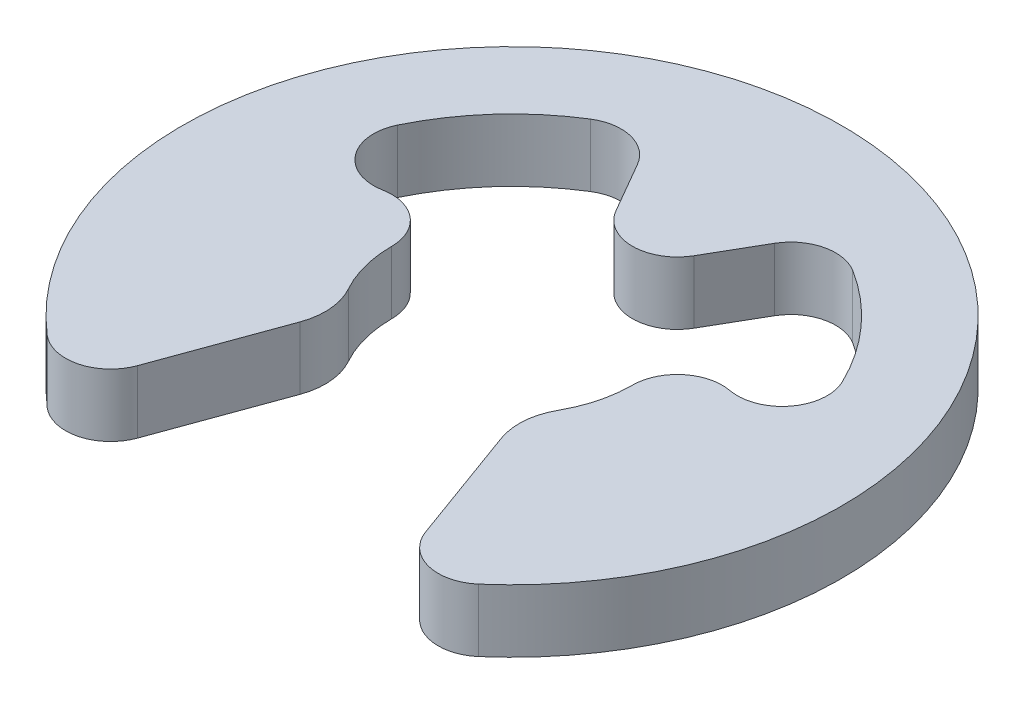
ISO-10303-21;
HEADER;
FILE_DESCRIPTION(('STEP AP214'),'2;1');
FILE_NAME('part.step','',(''),(''),'','','');
FILE_SCHEMA(('AUTOMOTIVE_DESIGN { 1 0 10303 214 1 1 1 1 }'));
ENDSEC;
DATA;
#1=APPLICATION_CONTEXT('core data for automotive mechanical design processes');
#2=APPLICATION_PROTOCOL_DEFINITION('international standard','automotive_design',2000,#1);
#3=PRODUCT_CONTEXT('',#1,'mechanical');
#4=PRODUCT('Part','Part','',(#3));
#5=PRODUCT_RELATED_PRODUCT_CATEGORY('part','',(#4));
#6=PRODUCT_DEFINITION_FORMATION('','',#4);
#7=PRODUCT_DEFINITION_CONTEXT('part definition',#1,'design');
#8=PRODUCT_DEFINITION('design','',#6,#7);
#9=PRODUCT_DEFINITION_SHAPE('','',#8);
#10=(LENGTH_UNIT() NAMED_UNIT(*) SI_UNIT(.MILLI.,.METRE.));
#11=(NAMED_UNIT(*) PLANE_ANGLE_UNIT() SI_UNIT($,.RADIAN.));
#12=(NAMED_UNIT(*) SI_UNIT($,.STERADIAN.) SOLID_ANGLE_UNIT());
#13=UNCERTAINTY_MEASURE_WITH_UNIT(LENGTH_MEASURE(1.E-05),#10,'distance_accuracy_value','');
#14=(GEOMETRIC_REPRESENTATION_CONTEXT(3) GLOBAL_UNCERTAINTY_ASSIGNED_CONTEXT((#13)) GLOBAL_UNIT_ASSIGNED_CONTEXT((#10,
#11,#12)) REPRESENTATION_CONTEXT('',''));
#15=CARTESIAN_POINT('',(0.,0.,0.));
#16=DIRECTION('',(0.,0.,1.));
#17=DIRECTION('',(1.,0.,0.));
#18=AXIS2_PLACEMENT_3D('',#15,#16,#17);
#19=CARTESIAN_POINT('',(1.780619997167,0.3,2.056760890229));
#20=DIRECTION('',(0.,-1.,0.));
#21=DIRECTION('',(0.,0.,-1.));
#22=AXIS2_PLACEMENT_3D('',#19,#20,#21);
#23=PLANE('',#22);
#24=CARTESIAN_POINT('',(0.,0.3,0.));
#25=DIRECTION('',(0.,-1.,0.));
#26=DIRECTION('',(0.,0.,-1.));
#27=AXIS2_PLACEMENT_3D('',#24,#25,#26);
#28=CIRCLE('',#27,3.15);
#29=CARTESIAN_POINT('',(-2.06177052303513,0.3,2.3815126097388));
#30=VERTEX_POINT('',#29);
#31=CARTESIAN_POINT('',(2.06177052303529,0.3,2.38151260973898));
#32=VERTEX_POINT('',#31);
#33=EDGE_CURVE('E297',#30,#32,#28,.T.);
#34=ORIENTED_EDGE('',*,*,#33,.F.);
#35=CARTESIAN_POINT('',(-1.780619997167,0.3,2.056760890229));
#36=DIRECTION('',(0.,-1.,0.));
#37=DIRECTION('',(0.,0.,-1.));
#38=AXIS2_PLACEMENT_3D('',#35,#36,#37);
#39=CIRCLE('',#38,0.4295454545455);
#40=CARTESIAN_POINT('',(-1.37697930323823,0.3,2.20367408815728));
#41=VERTEX_POINT('',#40);
#42=EDGE_CURVE('E204',#41,#30,#39,.T.);
#43=ORIENTED_EDGE('',*,*,#42,.F.);
#44=DIRECTION('',(0.342020143325699,0.,-0.939692620785897));
#45=VECTOR('',#44,1.);
#46=CARTESIAN_POINT('',(-1.376979303238,0.3,2.203674088157));
#47=LINE('',#46,#45);
#48=CARTESIAN_POINT('',(-0.962682154540703,0.3,1.06540202716686));
#49=VERTEX_POINT('',#48);
#50=EDGE_CURVE('E199',#41,#49,#47,.T.);
#51=ORIENTED_EDGE('',*,*,#50,.T.);
#52=CARTESIAN_POINT('',(-1.532370805892,0.3,0.8580523152756));
#53=DIRECTION('',(0.,-1.,0.));
#54=DIRECTION('',(0.,0.,-1.));
#55=AXIS2_PLACEMENT_3D('',#52,#53,#54);
#56=CIRCLE('',#55,0.60625);
#57=CARTESIAN_POINT('',(-1.00340294763031,0.3,0.561856320322884));
#58=VERTEX_POINT('',#57);
#59=EDGE_CURVE('E244',#58,#49,#56,.T.);
#60=ORIENTED_EDGE('',*,*,#59,.F.);
#61=CARTESIAN_POINT('',(0.,0.3,0.));
#62=DIRECTION('',(0.,-1.,0.));
#63=DIRECTION('',(0.,0.,-1.));
#64=AXIS2_PLACEMENT_3D('',#61,#62,#63);
#65=CIRCLE('',#64,1.15);
#66=CARTESIAN_POINT('',(-1.15,0.3,0.));
#67=VERTEX_POINT('',#66);
#68=EDGE_CURVE('E248',#58,#67,#65,.T.);
#69=ORIENTED_EDGE('',*,*,#68,.T.);
#70=CARTESIAN_POINT('',(-1.579545454545,0.3,0.));
#71=DIRECTION('',(0.,-1.,0.));
#72=DIRECTION('',(0.,0.,-1.));
#73=AXIS2_PLACEMENT_3D('',#70,#71,#72);
#74=CIRCLE('',#73,0.4295454545455);
#75=CARTESIAN_POINT('',(-1.659206384892,0.3,-0.422094105262049));
#76=VERTEX_POINT('',#75);
#77=EDGE_CURVE('E176',#76,#67,#74,.T.);
#78=ORIENTED_EDGE('',*,*,#77,.F.);
#79=CARTESIAN_POINT('',(-1.738867315239,0.3,-0.8441882105241));
#80=DIRECTION('',(0.,-1.,0.));
#81=DIRECTION('',(0.,0.,-1.));
#82=AXIS2_PLACEMENT_3D('',#79,#80,#81);
#83=CIRCLE('',#82,0.4295454545455);
#84=CARTESIAN_POINT('',(-2.1252822741809,0.3,-1.03178559064074));
#85=VERTEX_POINT('',#84);
#86=EDGE_CURVE('E253',#76,#85,#83,.T.);
#87=ORIENTED_EDGE('',*,*,#86,.T.);
#88=CARTESIAN_POINT('',(0.,0.3,0.));
#89=DIRECTION('',(0.,-1.,0.));
#90=DIRECTION('',(0.,0.,-1.));
#91=AXIS2_PLACEMENT_3D('',#88,#89,#90);
#92=CIRCLE('',#91,2.3625);
#93=CARTESIAN_POINT('',(-1.25386179097892,0.3,-2.00230788319957));
#94=VERTEX_POINT('',#93);
#95=EDGE_CURVE('E21',#85,#94,#92,.T.);
#96=ORIENTED_EDGE('',*,*,#95,.T.);
#97=CARTESIAN_POINT('',(-1.025886919892,0.3,-1.638251904436));
#98=DIRECTION('',(0.,-1.,0.));
#99=DIRECTION('',(0.,0.,-1.));
#100=AXIS2_PLACEMENT_3D('',#97,#98,#99);
#101=CIRCLE('',#100,0.4295454545455);
#102=CARTESIAN_POINT('',(-0.653889644175284,0.3,-1.85302463170888));
#103=VERTEX_POINT('',#102);
#104=EDGE_CURVE('E151',#94,#103,#101,.T.);
#105=ORIENTED_EDGE('',*,*,#104,.T.);
#106=DIRECTION('',(0.500000000000017,0.,0.866025403784429));
#107=VECTOR('',#106,1.);
#108=CARTESIAN_POINT('',(-0.6538896441751,0.3,-1.853024631709));
#109=LINE('',#108,#107);
#110=CARTESIAN_POINT('',(-0.371997275716427,0.3,-1.36477272727267));
#111=VERTEX_POINT('',#110);
#112=EDGE_CURVE('E135',#103,#111,#109,.T.);
#113=ORIENTED_EDGE('',*,*,#112,.T.);
#114=CARTESIAN_POINT('',(0.,0.3,-1.579545454545));
#115=DIRECTION('',(0.,-1.,0.));
#116=DIRECTION('',(0.,0.,-1.));
#117=AXIS2_PLACEMENT_3D('',#114,#115,#116);
#118=CIRCLE('',#117,0.4295454545455);
#119=CARTESIAN_POINT('',(0.37199727571656,0.3,-1.3647727272726));
#120=VERTEX_POINT('',#119);
#121=EDGE_CURVE('E239',#120,#111,#118,.T.);
#122=ORIENTED_EDGE('',*,*,#121,.F.);
#123=DIRECTION('',(0.500000000000017,0.,-0.866025403784429));
#124=VECTOR('',#123,1.);
#125=CARTESIAN_POINT('',(0.6538896441751,0.3,-1.853024631709));
#126=LINE('',#125,#124);
#127=CARTESIAN_POINT('',(0.653889644175093,0.3,-1.85302463170899));
#128=VERTEX_POINT('',#127);
#129=EDGE_CURVE('E235',#120,#128,#126,.T.);
#130=ORIENTED_EDGE('',*,*,#129,.T.);
#131=CARTESIAN_POINT('',(1.025886919892,0.3,-1.638251904436));
#132=DIRECTION('',(0.,-1.,0.));
#133=DIRECTION('',(0.,0.,-1.));
#134=AXIS2_PLACEMENT_3D('',#131,#132,#133);
#135=CIRCLE('',#134,0.4295454545455);
#136=CARTESIAN_POINT('',(1.25386179097899,0.3,-2.00230788319967));
#137=VERTEX_POINT('',#136);
#138=EDGE_CURVE('E154',#128,#137,#135,.T.);
#139=ORIENTED_EDGE('',*,*,#138,.T.);
#140=CARTESIAN_POINT('',(0.,0.3,0.));
#141=DIRECTION('',(0.,-1.,0.));
#142=DIRECTION('',(0.,0.,-1.));
#143=AXIS2_PLACEMENT_3D('',#140,#141,#142);
#144=CIRCLE('',#143,2.3625);
#145=CARTESIAN_POINT('',(2.12528227418064,0.3,-1.03178559064061));
#146=VERTEX_POINT('',#145);
#147=EDGE_CURVE('E223',#137,#146,#144,.T.);
#148=ORIENTED_EDGE('',*,*,#147,.T.);
#149=CARTESIAN_POINT('',(1.738867315239,0.3,-0.8441882105241));
#150=DIRECTION('',(0.,-1.,0.));
#151=DIRECTION('',(0.,0.,-1.));
#152=AXIS2_PLACEMENT_3D('',#149,#150,#151);
#153=CIRCLE('',#152,0.4295454545455);
#154=CARTESIAN_POINT('',(1.65920638489201,0.3,-0.422094105262072));
#155=VERTEX_POINT('',#154);
#156=EDGE_CURVE('E222',#146,#155,#153,.T.);
#157=ORIENTED_EDGE('',*,*,#156,.T.);
#158=CARTESIAN_POINT('',(1.579545454545,0.3,0.));
#159=DIRECTION('',(0.,-1.,0.));
#160=DIRECTION('',(0.,0.,-1.));
#161=AXIS2_PLACEMENT_3D('',#158,#159,#160);
#162=CIRCLE('',#161,0.4295454545455);
#163=CARTESIAN_POINT('',(1.14999999999975,0.3,0.));
#164=VERTEX_POINT('',#163);
#165=EDGE_CURVE('E181',#164,#155,#162,.T.);
#166=ORIENTED_EDGE('',*,*,#165,.F.);
#167=CARTESIAN_POINT('',(0.,0.3,0.));
#168=DIRECTION('',(0.,-1.,0.));
#169=DIRECTION('',(0.,0.,-1.));
#170=AXIS2_PLACEMENT_3D('',#167,#168,#169);
#171=CIRCLE('',#170,1.15);
#172=CARTESIAN_POINT('',(1.00340294763032,0.3,0.56185632032289));
#173=VERTEX_POINT('',#172);
#174=EDGE_CURVE('E228',#164,#173,#171,.T.);
#175=ORIENTED_EDGE('',*,*,#174,.T.);
#176=CARTESIAN_POINT('',(1.532370805892,0.3,0.8580523152756));
#177=DIRECTION('',(0.,-1.,0.));
#178=DIRECTION('',(0.,0.,-1.));
#179=AXIS2_PLACEMENT_3D('',#176,#177,#178);
#180=CIRCLE('',#179,0.60625);
#181=CARTESIAN_POINT('',(0.962682154540643,0.3,1.06540202716688));
#182=VERTEX_POINT('',#181);
#183=EDGE_CURVE('E28',#182,#173,#180,.T.);
#184=ORIENTED_EDGE('',*,*,#183,.F.);
#185=DIRECTION('',(0.342020143325699,0.,0.939692620785897));
#186=VECTOR('',#185,1.);
#187=CARTESIAN_POINT('',(1.376979303238,0.3,2.203674088157));
#188=LINE('',#187,#186);
#189=CARTESIAN_POINT('',(1.37697930323823,0.3,2.20367408815728));
#190=VERTEX_POINT('',#189);
#191=EDGE_CURVE('E11',#182,#190,#188,.T.);
#192=ORIENTED_EDGE('',*,*,#191,.T.);
#193=CARTESIAN_POINT('',(1.780619997167,0.3,2.056760890229));
#194=DIRECTION('',(0.,-1.,0.));
#195=DIRECTION('',(0.,0.,-1.));
#196=AXIS2_PLACEMENT_3D('',#193,#194,#195);
#197=CIRCLE('',#196,0.4295454545455);
#198=EDGE_CURVE('E302',#32,#190,#197,.T.);
#199=ORIENTED_EDGE('',*,*,#198,.F.);
#200=EDGE_LOOP('',(#34,#43,#51,#60,#69,#78,#87,#96,#105,#113,#122,#130,#139,#148,#157,#166,#175,
#184,#192,#199));
#201=FACE_BOUND('',#200,.T.);
#202=ADVANCED_FACE('F17',(#201),#23,.F.);
#203=CARTESIAN_POINT('',(1.376979303238,0.3,2.203674088157));
#204=DIRECTION('',(0.939692620785897,0.,-0.342020143325699));
#205=DIRECTION('',(0.,-1.,0.));
#206=AXIS2_PLACEMENT_3D('',#203,#204,#205);
#207=PLANE('',#206);
#208=ORIENTED_EDGE('',*,*,#191,.F.);
#209=DIRECTION('',(0.,1.,0.));
#210=VECTOR('',#209,1.);
#211=CARTESIAN_POINT('',(0.962682154540618,0.3,1.06540202716699));
#212=LINE('',#211,#210);
#213=CARTESIAN_POINT('',(0.962682154540587,-0.3,1.06540202716694));
#214=VERTEX_POINT('',#213);
#215=EDGE_CURVE('E227',#214,#182,#212,.T.);
#216=ORIENTED_EDGE('',*,*,#215,.F.);
#217=DIRECTION('',(-0.342020143325812,0.,-0.939692620785856));
#218=VECTOR('',#217,1.);
#219=CARTESIAN_POINT('',(1.376979303238,-0.3,2.203674088157));
#220=LINE('',#219,#218);
#221=CARTESIAN_POINT('',(1.37697930323824,-0.3,2.2036740881573));
#222=VERTEX_POINT('',#221);
#223=EDGE_CURVE('E187',#222,#214,#220,.T.);
#224=ORIENTED_EDGE('',*,*,#223,.F.);
#225=DIRECTION('',(0.,-1.,0.));
#226=VECTOR('',#225,1.);
#227=CARTESIAN_POINT('',(1.37697930323824,0.3,2.20367408815691));
#228=LINE('',#227,#226);
#229=EDGE_CURVE('E306',#190,#222,#228,.T.);
#230=ORIENTED_EDGE('',*,*,#229,.F.);
#231=EDGE_LOOP('',(#208,#216,#224,#230));
#232=FACE_BOUND('',#231,.T.);
#233=ADVANCED_FACE('F19',(#232),#207,.F.);
#234=CARTESIAN_POINT('',(1.532370805892,0.3,0.8580523152756));
#235=DIRECTION('',(0.,-1.,0.));
#236=DIRECTION('',(0.,0.,-1.));
#237=AXIS2_PLACEMENT_3D('',#234,#235,#236);
#238=CYLINDRICAL_SURFACE('',#237,0.60625);
#239=DIRECTION('',(0.,-1.,0.));
#240=VECTOR('',#239,1.);
#241=CARTESIAN_POINT('',(1.00340294763028,0.3,0.56185632032296));
#242=LINE('',#241,#240);
#243=CARTESIAN_POINT('',(1.00340294763032,-0.3,0.56185632032289));
#244=VERTEX_POINT('',#243);
#245=EDGE_CURVE('E224',#173,#244,#242,.T.);
#246=ORIENTED_EDGE('',*,*,#245,.T.);
#247=CARTESIAN_POINT('',(1.532370805892,-0.3,0.8580523152756));
#248=DIRECTION('',(0.,-1.,0.));
#249=DIRECTION('',(0.,0.,-1.));
#250=AXIS2_PLACEMENT_3D('',#247,#248,#249);
#251=CIRCLE('',#250,0.60625);
#252=EDGE_CURVE('E191',#214,#244,#251,.T.);
#253=ORIENTED_EDGE('',*,*,#252,.F.);
#254=ORIENTED_EDGE('',*,*,#215,.T.);
#255=ORIENTED_EDGE('',*,*,#183,.T.);
#256=EDGE_LOOP('',(#246,#253,#254,#255));
#257=FACE_BOUND('',#256,.T.);
#258=ADVANCED_FACE('F502',(#257),#238,.T.);
#259=CARTESIAN_POINT('',(0.,0.3,0.));
#260=DIRECTION('',(0.,-1.,0.));
#261=DIRECTION('',(0.,0.,-1.));
#262=AXIS2_PLACEMENT_3D('',#259,#260,#261);
#263=CYLINDRICAL_SURFACE('',#262,1.15);
#264=ORIENTED_EDGE('',*,*,#174,.F.);
#265=DIRECTION('',(0.,1.,0.));
#266=VECTOR('',#265,1.);
#267=CARTESIAN_POINT('',(1.1499999999995,0.3,0.));
#268=LINE('',#267,#266);
#269=CARTESIAN_POINT('',(1.1499999999995,-0.3,0.));
#270=VERTEX_POINT('',#269);
#271=EDGE_CURVE('E188',#270,#164,#268,.T.);
#272=ORIENTED_EDGE('',*,*,#271,.F.);
#273=CARTESIAN_POINT('',(0.,-0.3,0.));
#274=DIRECTION('',(0.,1.,0.));
#275=DIRECTION('',(0.,0.,-1.));
#276=AXIS2_PLACEMENT_3D('',#273,#274,#275);
#277=CIRCLE('',#276,1.15);
#278=EDGE_CURVE('E209',#244,#270,#277,.T.);
#279=ORIENTED_EDGE('',*,*,#278,.F.);
#280=ORIENTED_EDGE('',*,*,#245,.F.);
#281=EDGE_LOOP('',(#264,#272,#279,#280));
#282=FACE_BOUND('',#281,.T.);
#283=ADVANCED_FACE('F518',(#282),#263,.F.);
#284=CARTESIAN_POINT('',(1.738867315239,0.3,-0.8441882105241));
#285=DIRECTION('',(0.,-1.,0.));
#286=DIRECTION('',(0.794457654825738,0.,0.607319549075105));
#287=AXIS2_PLACEMENT_3D('',#284,#285,#286);
#288=CYLINDRICAL_SURFACE('',#287,0.4295454545455);
#289=ORIENTED_EDGE('',*,*,#156,.F.);
#290=DIRECTION('',(0.,-1.,0.));
#291=VECTOR('',#290,1.);
#292=CARTESIAN_POINT('',(2.12528227418055,0.3,-1.03178559064078));
#293=LINE('',#292,#291);
#294=CARTESIAN_POINT('',(2.12528227418064,-0.3,-1.03178559064061));
#295=VERTEX_POINT('',#294);
#296=EDGE_CURVE('E218',#146,#295,#293,.T.);
#297=ORIENTED_EDGE('',*,*,#296,.T.);
#298=CARTESIAN_POINT('',(1.738867315239,-0.3,-0.8441882105241));
#299=DIRECTION('',(0.,1.,0.));
#300=DIRECTION('',(0.,0.,-1.));
#301=AXIS2_PLACEMENT_3D('',#298,#299,#300);
#302=CIRCLE('',#301,0.4295454545455);
#303=CARTESIAN_POINT('',(1.65920638489201,-0.3,-0.422094105262072));
#304=VERTEX_POINT('',#303);
#305=EDGE_CURVE('E205',#304,#295,#302,.T.);
#306=ORIENTED_EDGE('',*,*,#305,.F.);
#307=DIRECTION('',(0.,-1.,0.));
#308=VECTOR('',#307,1.);
#309=CARTESIAN_POINT('',(1.65920638489201,0.3,-0.422094105262071));
#310=LINE('',#309,#308);
#311=EDGE_CURVE('E288',#155,#304,#310,.T.);
#312=ORIENTED_EDGE('',*,*,#311,.F.);
#313=EDGE_LOOP('',(#289,#297,#306,#312));
#314=FACE_BOUND('',#313,.T.);
#315=ADVANCED_FACE('F459',(#314),#288,.F.);
#316=CARTESIAN_POINT('',(0.,0.3,0.));
#317=DIRECTION('',(0.,-1.,0.));
#318=DIRECTION('',(0.,0.,-1.));
#319=AXIS2_PLACEMENT_3D('',#316,#317,#318);
#320=CYLINDRICAL_SURFACE('',#319,2.3625);
#321=ORIENTED_EDGE('',*,*,#147,.F.);
#322=DIRECTION('',(0.,-1.,0.));
#323=VECTOR('',#322,1.);
#324=CARTESIAN_POINT('',(1.25386179097885,0.3,-2.00230788319976));
#325=LINE('',#324,#323);
#326=CARTESIAN_POINT('',(1.25386179097899,-0.3,-2.00230788319967));
#327=VERTEX_POINT('',#326);
#328=EDGE_CURVE('E177',#137,#327,#325,.T.);
#329=ORIENTED_EDGE('',*,*,#328,.T.);
#330=CARTESIAN_POINT('',(0.,-0.3,0.));
#331=DIRECTION('',(0.,1.,0.));
#332=DIRECTION('',(0.,0.,-1.));
#333=AXIS2_PLACEMENT_3D('',#330,#331,#332);
#334=CIRCLE('',#333,2.3625);
#335=EDGE_CURVE('E198',#295,#327,#334,.T.);
#336=ORIENTED_EDGE('',*,*,#335,.F.);
#337=ORIENTED_EDGE('',*,*,#296,.F.);
#338=EDGE_LOOP('',(#321,#329,#336,#337));
#339=FACE_BOUND('',#338,.T.);
#340=ADVANCED_FACE('F469',(#339),#320,.F.);
#341=CARTESIAN_POINT('',(0.6538896441751,0.3,-1.853024631709));
#342=DIRECTION('',(-0.866025403784429,0.,-0.500000000000017));
#343=DIRECTION('',(-0.500000000000017,0.,0.866025403784429));
#344=AXIS2_PLACEMENT_3D('',#341,#342,#343);
#345=PLANE('',#344);
#346=ORIENTED_EDGE('',*,*,#129,.F.);
#347=DIRECTION('',(0.,1.,0.));
#348=VECTOR('',#347,1.);
#349=CARTESIAN_POINT('',(0.371997275716852,0.3,-1.3647727272728));
#350=LINE('',#349,#348);
#351=CARTESIAN_POINT('',(0.371997275716497,-0.3,-1.36477272727259));
#352=VERTEX_POINT('',#351);
#353=EDGE_CURVE('E271',#352,#120,#350,.T.);
#354=ORIENTED_EDGE('',*,*,#353,.F.);
#355=DIRECTION('',(-0.50000000000017,0.,0.866025403784341));
#356=VECTOR('',#355,1.);
#357=CARTESIAN_POINT('',(0.6538896441751,-0.3,-1.853024631709));
#358=LINE('',#357,#356);
#359=CARTESIAN_POINT('',(0.653889644175112,-0.3,-1.85302463170902));
#360=VERTEX_POINT('',#359);
#361=EDGE_CURVE('E193',#360,#352,#358,.T.);
#362=ORIENTED_EDGE('',*,*,#361,.F.);
#363=DIRECTION('',(0.,-1.,0.));
#364=VECTOR('',#363,1.);
#365=CARTESIAN_POINT('',(0.6538896441751,0.3,-1.853024631709));
#366=LINE('',#365,#364);
#367=EDGE_CURVE('E243',#128,#360,#366,.T.);
#368=ORIENTED_EDGE('',*,*,#367,.F.);
#369=EDGE_LOOP('',(#346,#354,#362,#368));
#370=FACE_BOUND('',#369,.T.);
#371=ADVANCED_FACE('F478',(#370),#345,.F.);
#372=CARTESIAN_POINT('',(0.,0.3,-1.579545454545));
#373=DIRECTION('',(0.,-1.,0.));
#374=DIRECTION('',(0.,0.,1.));
#375=AXIS2_PLACEMENT_3D('',#372,#373,#374);
#376=CYLINDRICAL_SURFACE('',#375,0.4295454545455);
#377=DIRECTION('',(0.,-1.,0.));
#378=VECTOR('',#377,1.);
#379=CARTESIAN_POINT('',(-0.371997275716586,0.3,-1.36477272727295));
#380=LINE('',#379,#378);
#381=CARTESIAN_POINT('',(-0.371997275716364,-0.3,-1.36477272727267));
#382=VERTEX_POINT('',#381);
#383=EDGE_CURVE('E141',#111,#382,#380,.T.);
#384=ORIENTED_EDGE('',*,*,#383,.T.);
#385=CARTESIAN_POINT('',(0.,-0.3,-1.579545454545));
#386=DIRECTION('',(0.,-1.,0.));
#387=DIRECTION('',(0.,0.,-1.));
#388=AXIS2_PLACEMENT_3D('',#385,#386,#387);
#389=CIRCLE('',#388,0.4295454545455);
#390=EDGE_CURVE('E197',#352,#382,#389,.T.);
#391=ORIENTED_EDGE('',*,*,#390,.F.);
#392=ORIENTED_EDGE('',*,*,#353,.T.);
#393=ORIENTED_EDGE('',*,*,#121,.T.);
#394=EDGE_LOOP('',(#384,#391,#392,#393));
#395=FACE_BOUND('',#394,.T.);
#396=ADVANCED_FACE('F481',(#395),#376,.T.);
#397=CARTESIAN_POINT('',(-0.6538896441751,0.3,-1.853024631709));
#398=DIRECTION('',(0.866025403784429,0.,-0.500000000000017));
#399=DIRECTION('',(0.,-1.,0.));
#400=AXIS2_PLACEMENT_3D('',#397,#398,#399);
#401=PLANE('',#400);
#402=ORIENTED_EDGE('',*,*,#112,.F.);
#403=DIRECTION('',(0.,-1.,0.));
#404=VECTOR('',#403,1.);
#405=CARTESIAN_POINT('',(-0.65388964417548,0.3,-1.85302463170878));
#406=LINE('',#405,#404);
#407=CARTESIAN_POINT('',(-0.653889644175303,-0.3,-1.85302463170891));
#408=VERTEX_POINT('',#407);
#409=EDGE_CURVE('E139',#103,#408,#406,.T.);
#410=ORIENTED_EDGE('',*,*,#409,.T.);
#411=DIRECTION('',(-0.50000000000017,0.,-0.866025403784341));
#412=VECTOR('',#411,1.);
#413=CARTESIAN_POINT('',(-0.3719972757165,-0.3,-1.364772727273));
#414=LINE('',#413,#412);
#415=EDGE_CURVE('E231',#382,#408,#414,.T.);
#416=ORIENTED_EDGE('',*,*,#415,.F.);
#417=ORIENTED_EDGE('',*,*,#383,.F.);
#418=EDGE_LOOP('',(#402,#410,#416,#417));
#419=FACE_BOUND('',#418,.T.);
#420=ADVANCED_FACE('F137',(#419),#401,.F.);
#421=CARTESIAN_POINT('',(0.,0.3,0.));
#422=DIRECTION('',(0.,-1.,0.));
#423=DIRECTION('',(0.,0.,-1.));
#424=AXIS2_PLACEMENT_3D('',#421,#422,#423);
#425=CYLINDRICAL_SURFACE('',#424,2.3625);
#426=ORIENTED_EDGE('',*,*,#95,.F.);
#427=DIRECTION('',(0.,-1.,0.));
#428=VECTOR('',#427,1.);
#429=CARTESIAN_POINT('',(-2.12528227418082,0.3,-1.03178559064091));
#430=LINE('',#429,#428);
#431=CARTESIAN_POINT('',(-2.1252822741809,-0.3,-1.03178559064074));
#432=VERTEX_POINT('',#431);
#433=EDGE_CURVE('E256',#85,#432,#430,.T.);
#434=ORIENTED_EDGE('',*,*,#433,.T.);
#435=CARTESIAN_POINT('',(0.,-0.3,0.));
#436=DIRECTION('',(0.,1.,0.));
#437=DIRECTION('',(0.,0.,-1.));
#438=AXIS2_PLACEMENT_3D('',#435,#436,#437);
#439=CIRCLE('',#438,2.3625);
#440=CARTESIAN_POINT('',(-1.25386179097892,-0.3,-2.00230788319957));
#441=VERTEX_POINT('',#440);
#442=EDGE_CURVE('E126',#441,#432,#439,.T.);
#443=ORIENTED_EDGE('',*,*,#442,.F.);
#444=DIRECTION('',(0.,-1.,0.));
#445=VECTOR('',#444,1.);
#446=CARTESIAN_POINT('',(-1.25386179097878,0.3,-2.00230788319965));
#447=LINE('',#446,#445);
#448=EDGE_CURVE('E159',#94,#441,#447,.T.);
#449=ORIENTED_EDGE('',*,*,#448,.F.);
#450=EDGE_LOOP('',(#426,#434,#443,#449));
#451=FACE_BOUND('',#450,.T.);
#452=ADVANCED_FACE('F482',(#451),#425,.F.);
#453=CARTESIAN_POINT('',(-1.738867315239,0.3,-0.8441882105241));
#454=DIRECTION('',(0.,-1.,0.));
#455=DIRECTION('',(-0.794457654825737,0.,0.607319549075106));
#456=AXIS2_PLACEMENT_3D('',#453,#454,#455);
#457=CYLINDRICAL_SURFACE('',#456,0.4295454545455);
#458=ORIENTED_EDGE('',*,*,#86,.F.);
#459=DIRECTION('',(0.,1.,0.));
#460=VECTOR('',#459,1.);
#461=CARTESIAN_POINT('',(-1.659206384892,0.3,-0.422094105262026));
#462=LINE('',#461,#460);
#463=CARTESIAN_POINT('',(-1.659206384892,-0.3,-0.422094105262026));
#464=VERTEX_POINT('',#463);
#465=EDGE_CURVE('E160',#464,#76,#462,.T.);
#466=ORIENTED_EDGE('',*,*,#465,.F.);
#467=CARTESIAN_POINT('',(-1.738867315239,-0.3,-0.8441882105241));
#468=DIRECTION('',(0.,1.,0.));
#469=DIRECTION('',(0.,0.,-1.));
#470=AXIS2_PLACEMENT_3D('',#467,#468,#469);
#471=CIRCLE('',#470,0.4295454545455);
#472=EDGE_CURVE('E210',#432,#464,#471,.T.);
#473=ORIENTED_EDGE('',*,*,#472,.F.);
#474=ORIENTED_EDGE('',*,*,#433,.F.);
#475=EDGE_LOOP('',(#458,#466,#473,#474));
#476=FACE_BOUND('',#475,.T.);
#477=ADVANCED_FACE('F486',(#476),#457,.F.);
#478=CARTESIAN_POINT('',(0.,0.3,0.));
#479=DIRECTION('',(0.,-1.,0.));
#480=DIRECTION('',(0.,0.,-1.));
#481=AXIS2_PLACEMENT_3D('',#478,#479,#480);
#482=CYLINDRICAL_SURFACE('',#481,1.15);
#483=ORIENTED_EDGE('',*,*,#68,.F.);
#484=DIRECTION('',(0.,1.,0.));
#485=VECTOR('',#484,1.);
#486=CARTESIAN_POINT('',(-1.00340294763026,0.3,0.561856320322948));
#487=LINE('',#486,#485);
#488=CARTESIAN_POINT('',(-1.0034029476303,-0.3,0.561856320322878));
#489=VERTEX_POINT('',#488);
#490=EDGE_CURVE('E249',#489,#58,#487,.T.);
#491=ORIENTED_EDGE('',*,*,#490,.F.);
#492=CARTESIAN_POINT('',(0.,-0.3,0.));
#493=DIRECTION('',(0.,1.,0.));
#494=DIRECTION('',(0.,0.,-1.));
#495=AXIS2_PLACEMENT_3D('',#492,#493,#494);
#496=CIRCLE('',#495,1.15);
#497=CARTESIAN_POINT('',(-1.15,-0.3,0.));
#498=VERTEX_POINT('',#497);
#499=EDGE_CURVE('E213',#498,#489,#496,.T.);
#500=ORIENTED_EDGE('',*,*,#499,.F.);
#501=DIRECTION('',(0.,-1.,0.));
#502=VECTOR('',#501,1.);
#503=CARTESIAN_POINT('',(-1.15,0.3,0.));
#504=LINE('',#503,#502);
#505=EDGE_CURVE('E172',#67,#498,#504,.T.);
#506=ORIENTED_EDGE('',*,*,#505,.F.);
#507=EDGE_LOOP('',(#483,#491,#500,#506));
#508=FACE_BOUND('',#507,.T.);
#509=ADVANCED_FACE('F438',(#508),#482,.F.);
#510=CARTESIAN_POINT('',(-1.532370805892,0.3,0.8580523152756));
#511=DIRECTION('',(0.,-1.,0.));
#512=DIRECTION('',(0.,0.,-1.));
#513=AXIS2_PLACEMENT_3D('',#510,#511,#512);
#514=CYLINDRICAL_SURFACE('',#513,0.60625);
#515=DIRECTION('',(0.,-1.,0.));
#516=VECTOR('',#515,1.);
#517=CARTESIAN_POINT('',(-0.962682154540737,0.3,1.06540202716695));
#518=LINE('',#517,#516);
#519=CARTESIAN_POINT('',(-0.962682154540647,-0.3,1.06540202716691));
#520=VERTEX_POINT('',#519);
#521=EDGE_CURVE('E203',#49,#520,#518,.T.);
#522=ORIENTED_EDGE('',*,*,#521,.T.);
#523=CARTESIAN_POINT('',(-1.532370805892,-0.3,0.8580523152756));
#524=DIRECTION('',(0.,-1.,0.));
#525=DIRECTION('',(0.,0.,-1.));
#526=AXIS2_PLACEMENT_3D('',#523,#524,#525);
#527=CIRCLE('',#526,0.60625);
#528=EDGE_CURVE('E279',#489,#520,#527,.T.);
#529=ORIENTED_EDGE('',*,*,#528,.F.);
#530=ORIENTED_EDGE('',*,*,#490,.T.);
#531=ORIENTED_EDGE('',*,*,#59,.T.);
#532=EDGE_LOOP('',(#522,#529,#530,#531));
#533=FACE_BOUND('',#532,.T.);
#534=ADVANCED_FACE('F442',(#533),#514,.T.);
#535=CARTESIAN_POINT('',(-1.376979303238,0.3,2.203674088157));
#536=DIRECTION('',(-0.939692620785897,0.,-0.342020143325699));
#537=DIRECTION('',(-0.342020143325699,0.,0.939692620785897));
#538=AXIS2_PLACEMENT_3D('',#535,#536,#537);
#539=PLANE('',#538);
#540=ORIENTED_EDGE('',*,*,#50,.F.);
#541=DIRECTION('',(0.,1.,0.));
#542=VECTOR('',#541,1.);
#543=CARTESIAN_POINT('',(-1.37697930323824,0.3,2.20367408815691));
#544=LINE('',#543,#542);
#545=CARTESIAN_POINT('',(-1.37697930323824,-0.3,2.2036740881573));
#546=VERTEX_POINT('',#545);
#547=EDGE_CURVE('E217',#546,#41,#544,.T.);
#548=ORIENTED_EDGE('',*,*,#547,.F.);
#549=DIRECTION('',(-0.342020143325812,0.,0.939692620785856));
#550=VECTOR('',#549,1.);
#551=CARTESIAN_POINT('',(-0.9626821545406,-0.3,1.065402027167));
#552=LINE('',#551,#550);
#553=EDGE_CURVE('E283',#520,#546,#552,.T.);
#554=ORIENTED_EDGE('',*,*,#553,.F.);
#555=ORIENTED_EDGE('',*,*,#521,.F.);
#556=EDGE_LOOP('',(#540,#548,#554,#555));
#557=FACE_BOUND('',#556,.T.);
#558=ADVANCED_FACE('F597',(#557),#539,.F.);
#559=CARTESIAN_POINT('',(-1.780619997167,0.3,2.056760890229));
#560=DIRECTION('',(0.,-1.,0.));
#561=DIRECTION('',(0.251359531803228,0.,0.96789378847664));
#562=AXIS2_PLACEMENT_3D('',#559,#560,#561);
#563=CYLINDRICAL_SURFACE('',#562,0.4295454545455);
#564=DIRECTION('',(0.,1.,0.));
#565=VECTOR('',#564,1.);
#566=CARTESIAN_POINT('',(-2.0617705230348,0.3,2.38151260973877));
#567=LINE('',#566,#565);
#568=CARTESIAN_POINT('',(-2.06177052303498,-0.3,2.38151260973862));
#569=VERTEX_POINT('',#568);
#570=EDGE_CURVE('E259',#569,#30,#567,.T.);
#571=ORIENTED_EDGE('',*,*,#570,.F.);
#572=CARTESIAN_POINT('',(-1.780619997167,-0.3,2.056760890229));
#573=DIRECTION('',(0.,-1.,0.));
#574=DIRECTION('',(0.,0.,-1.));
#575=AXIS2_PLACEMENT_3D('',#572,#573,#574);
#576=CIRCLE('',#575,0.4295454545455);
#577=EDGE_CURVE('E316',#546,#569,#576,.T.);
#578=ORIENTED_EDGE('',*,*,#577,.F.);
#579=ORIENTED_EDGE('',*,*,#547,.T.);
#580=ORIENTED_EDGE('',*,*,#42,.T.);
#581=EDGE_LOOP('',(#571,#578,#579,#580));
#582=FACE_BOUND('',#581,.T.);
#583=ADVANCED_FACE('F379',(#582),#563,.T.);
#584=CARTESIAN_POINT('',(1.780619997167,0.3,2.056760890229));
#585=DIRECTION('',(0.,-1.,0.));
#586=DIRECTION('',(-0.251359531803228,0.,0.96789378847664));
#587=AXIS2_PLACEMENT_3D('',#584,#585,#586);
#588=CYLINDRICAL_SURFACE('',#587,0.4295454545455);
#589=ORIENTED_EDGE('',*,*,#229,.T.);
#590=CARTESIAN_POINT('',(1.780619997167,-0.3,2.056760890229));
#591=DIRECTION('',(0.,-1.,0.));
#592=DIRECTION('',(0.,0.,-1.));
#593=AXIS2_PLACEMENT_3D('',#590,#591,#592);
#594=CIRCLE('',#593,0.4295454545455);
#595=CARTESIAN_POINT('',(2.06177052303529,-0.3,2.38151260973898));
#596=VERTEX_POINT('',#595);
#597=EDGE_CURVE('E183',#596,#222,#594,.T.);
#598=ORIENTED_EDGE('',*,*,#597,.F.);
#599=DIRECTION('',(0.,1.,0.));
#600=VECTOR('',#599,1.);
#601=CARTESIAN_POINT('',(2.06177052303511,0.3,2.38151260973913));
#602=LINE('',#601,#600);
#603=EDGE_CURVE('E301',#596,#32,#602,.T.);
#604=ORIENTED_EDGE('',*,*,#603,.T.);
#605=ORIENTED_EDGE('',*,*,#198,.T.);
#606=EDGE_LOOP('',(#589,#598,#604,#605));
#607=FACE_BOUND('',#606,.T.);
#608=ADVANCED_FACE('F387',(#607),#588,.T.);
#609=CARTESIAN_POINT('',(1.780619997167,-0.3,2.056760890229));
#610=DIRECTION('',(0.,-1.,0.));
#611=DIRECTION('',(0.,0.,-1.));
#612=AXIS2_PLACEMENT_3D('',#609,#610,#611);
#613=PLANE('',#612);
#614=CARTESIAN_POINT('',(0.,-0.3,0.));
#615=DIRECTION('',(0.,-1.,0.));
#616=DIRECTION('',(0.,0.,-1.));
#617=AXIS2_PLACEMENT_3D('',#614,#615,#616);
#618=CIRCLE('',#617,3.15);
#619=EDGE_CURVE('E312',#569,#596,#618,.T.);
#620=ORIENTED_EDGE('',*,*,#619,.T.);
#621=ORIENTED_EDGE('',*,*,#597,.T.);
#622=ORIENTED_EDGE('',*,*,#223,.T.);
#623=ORIENTED_EDGE('',*,*,#252,.T.);
#624=ORIENTED_EDGE('',*,*,#278,.T.);
#625=CARTESIAN_POINT('',(1.579545454545,-0.3,0.));
#626=DIRECTION('',(0.,-1.,0.));
#627=DIRECTION('',(0.,0.,-1.));
#628=AXIS2_PLACEMENT_3D('',#625,#626,#627);
#629=CIRCLE('',#628,0.4295454545455);
#630=EDGE_CURVE('E284',#270,#304,#629,.T.);
#631=ORIENTED_EDGE('',*,*,#630,.T.);
#632=ORIENTED_EDGE('',*,*,#305,.T.);
#633=ORIENTED_EDGE('',*,*,#335,.T.);
#634=CARTESIAN_POINT('',(1.025886919892,-0.3,-1.638251904436));
#635=DIRECTION('',(0.,1.,0.));
#636=DIRECTION('',(0.,0.,-1.));
#637=AXIS2_PLACEMENT_3D('',#634,#635,#636);
#638=CIRCLE('',#637,0.4295454545455);
#639=EDGE_CURVE('E182',#327,#360,#638,.T.);
#640=ORIENTED_EDGE('',*,*,#639,.T.);
#641=ORIENTED_EDGE('',*,*,#361,.T.);
#642=ORIENTED_EDGE('',*,*,#390,.T.);
#643=ORIENTED_EDGE('',*,*,#415,.T.);
#644=CARTESIAN_POINT('',(-1.025886919892,-0.3,-1.638251904436));
#645=DIRECTION('',(0.,1.,0.));
#646=DIRECTION('',(0.,0.,-1.));
#647=AXIS2_PLACEMENT_3D('',#644,#645,#646);
#648=CIRCLE('',#647,0.4295454545455);
#649=EDGE_CURVE('E152',#408,#441,#648,.T.);
#650=ORIENTED_EDGE('',*,*,#649,.T.);
#651=ORIENTED_EDGE('',*,*,#442,.T.);
#652=ORIENTED_EDGE('',*,*,#472,.T.);
#653=CARTESIAN_POINT('',(-1.579545454545,-0.3,0.));
#654=DIRECTION('',(0.,-1.,0.));
#655=DIRECTION('',(0.,0.,-1.));
#656=AXIS2_PLACEMENT_3D('',#653,#654,#655);
#657=CIRCLE('',#656,0.4295454545455);
#658=EDGE_CURVE('E169',#464,#498,#657,.T.);
#659=ORIENTED_EDGE('',*,*,#658,.T.);
#660=ORIENTED_EDGE('',*,*,#499,.T.);
#661=ORIENTED_EDGE('',*,*,#528,.T.);
#662=ORIENTED_EDGE('',*,*,#553,.T.);
#663=ORIENTED_EDGE('',*,*,#577,.T.);
#664=EDGE_LOOP('',(#620,#621,#622,#623,#624,#631,#632,#633,#640,#641,#642,#643,#650,#651,#652,
#659,#660,#661,#662,#663));
#665=FACE_BOUND('',#664,.T.);
#666=ADVANCED_FACE('F370',(#665),#613,.T.);
#667=CARTESIAN_POINT('',(1.579545454545,0.3,0.));
#668=DIRECTION('',(0.,-1.,0.));
#669=DIRECTION('',(0.,0.,-1.));
#670=AXIS2_PLACEMENT_3D('',#667,#668,#669);
#671=CYLINDRICAL_SURFACE('',#670,0.4295454545455);
#672=ORIENTED_EDGE('',*,*,#165,.T.);
#673=ORIENTED_EDGE('',*,*,#311,.T.);
#674=ORIENTED_EDGE('',*,*,#630,.F.);
#675=ORIENTED_EDGE('',*,*,#271,.T.);
#676=EDGE_LOOP('',(#672,#673,#674,#675));
#677=FACE_BOUND('',#676,.T.);
#678=ADVANCED_FACE('F466',(#677),#671,.T.);
#679=CARTESIAN_POINT('',(1.025886919892,0.3,-1.638251904436));
#680=DIRECTION('',(0.,-1.,0.));
#681=DIRECTION('',(0.,0.,-1.));
#682=AXIS2_PLACEMENT_3D('',#679,#680,#681);
#683=CYLINDRICAL_SURFACE('',#682,0.4295454545455);
#684=ORIENTED_EDGE('',*,*,#138,.F.);
#685=ORIENTED_EDGE('',*,*,#367,.T.);
#686=ORIENTED_EDGE('',*,*,#639,.F.);
#687=ORIENTED_EDGE('',*,*,#328,.F.);
#688=EDGE_LOOP('',(#684,#685,#686,#687));
#689=FACE_BOUND('',#688,.T.);
#690=ADVANCED_FACE('F476',(#689),#683,.F.);
#691=CARTESIAN_POINT('',(-1.025886919892,0.3,-1.638251904436));
#692=DIRECTION('',(0.,-1.,0.));
#693=DIRECTION('',(0.,0.,-1.));
#694=AXIS2_PLACEMENT_3D('',#691,#692,#693);
#695=CYLINDRICAL_SURFACE('',#694,0.4295454545455);
#696=ORIENTED_EDGE('',*,*,#104,.F.);
#697=ORIENTED_EDGE('',*,*,#448,.T.);
#698=ORIENTED_EDGE('',*,*,#649,.F.);
#699=ORIENTED_EDGE('',*,*,#409,.F.);
#700=EDGE_LOOP('',(#696,#697,#698,#699));
#701=FACE_BOUND('',#700,.T.);
#702=ADVANCED_FACE('F149',(#701),#695,.F.);
#703=CARTESIAN_POINT('',(-1.579545454545,0.3,0.));
#704=DIRECTION('',(0.,-1.,0.));
#705=DIRECTION('',(0.,0.,-1.));
#706=AXIS2_PLACEMENT_3D('',#703,#704,#705);
#707=CYLINDRICAL_SURFACE('',#706,0.4295454545455);
#708=ORIENTED_EDGE('',*,*,#77,.T.);
#709=ORIENTED_EDGE('',*,*,#505,.T.);
#710=ORIENTED_EDGE('',*,*,#658,.F.);
#711=ORIENTED_EDGE('',*,*,#465,.T.);
#712=EDGE_LOOP('',(#708,#709,#710,#711));
#713=FACE_BOUND('',#712,.T.);
#714=ADVANCED_FACE('F448',(#713),#707,.T.);
#715=CARTESIAN_POINT('',(0.,0.3,0.));
#716=DIRECTION('',(0.,-1.,0.));
#717=DIRECTION('',(0.,0.,-1.));
#718=AXIS2_PLACEMENT_3D('',#715,#716,#717);
#719=CYLINDRICAL_SURFACE('',#718,3.15);
#720=ORIENTED_EDGE('',*,*,#33,.T.);
#721=ORIENTED_EDGE('',*,*,#603,.F.);
#722=ORIENTED_EDGE('',*,*,#619,.F.);
#723=ORIENTED_EDGE('',*,*,#570,.T.);
#724=EDGE_LOOP('',(#720,#721,#722,#723));
#725=FACE_BOUND('',#724,.T.);
#726=ADVANCED_FACE('F382',(#725),#719,.T.);
#727=CLOSED_SHELL('',(#202,#233,#258,#283,#315,#340,#371,#396,#420,#452,#477,#509,#534,#558,
#583,#608,#666,#678,#690,#702,#714,#726));
#728=MANIFOLD_SOLID_BREP('B1',#727);
#729=ADVANCED_BREP_SHAPE_REPRESENTATION('',(#18,#728),#14);
#730=SHAPE_DEFINITION_REPRESENTATION(#9,#729);
ENDSEC;
END-ISO-10303-21;
